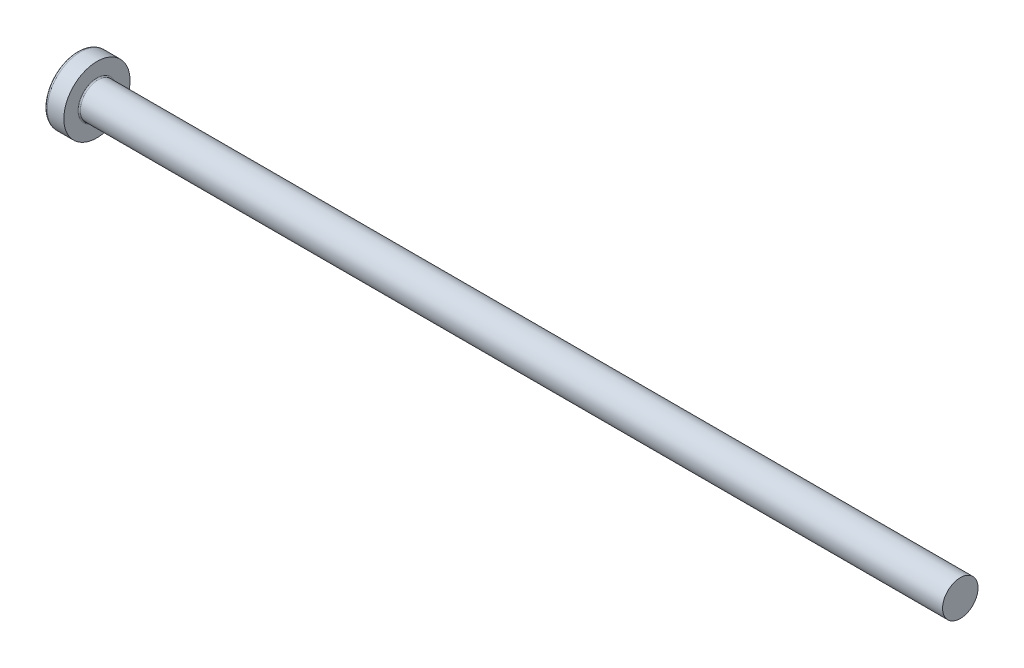
ISO-10303-21;
HEADER;
FILE_DESCRIPTION(('STEP AP214'),'2;1');
FILE_NAME('part.step','',(''),(''),'','','');
FILE_SCHEMA(('AUTOMOTIVE_DESIGN { 1 0 10303 214 1 1 1 1 }'));
ENDSEC;
DATA;
#1=APPLICATION_CONTEXT('core data for automotive mechanical design processes');
#2=APPLICATION_PROTOCOL_DEFINITION('international standard','automotive_design',2000,#1);
#3=PRODUCT_CONTEXT('',#1,'mechanical');
#4=PRODUCT('Part','Part','',(#3));
#5=PRODUCT_RELATED_PRODUCT_CATEGORY('part','',(#4));
#6=PRODUCT_DEFINITION_FORMATION('','',#4);
#7=PRODUCT_DEFINITION_CONTEXT('part definition',#1,'design');
#8=PRODUCT_DEFINITION('design','',#6,#7);
#9=PRODUCT_DEFINITION_SHAPE('','',#8);
#10=(LENGTH_UNIT() NAMED_UNIT(*) SI_UNIT(.MILLI.,.METRE.));
#11=(NAMED_UNIT(*) PLANE_ANGLE_UNIT() SI_UNIT($,.RADIAN.));
#12=(NAMED_UNIT(*) SI_UNIT($,.STERADIAN.) SOLID_ANGLE_UNIT());
#13=UNCERTAINTY_MEASURE_WITH_UNIT(LENGTH_MEASURE(1.E-05),#10,'distance_accuracy_value','');
#14=(GEOMETRIC_REPRESENTATION_CONTEXT(3) GLOBAL_UNCERTAINTY_ASSIGNED_CONTEXT((#13)) GLOBAL_UNIT_ASSIGNED_CONTEXT((#10,
#11,#12)) REPRESENTATION_CONTEXT('',''));
#15=CARTESIAN_POINT('',(0.,0.,0.));
#16=DIRECTION('',(0.,0.,1.));
#17=DIRECTION('',(1.,0.,0.));
#18=AXIS2_PLACEMENT_3D('',#15,#16,#17);
#19=CARTESIAN_POINT('',(5.,0.,0.));
#20=DIRECTION('',(-1.,0.,0.));
#21=DIRECTION('',(0.,1.,0.));
#22=AXIS2_PLACEMENT_3D('',#19,#20,#21);
#23=SPHERICAL_SURFACE('',#22,5.);
#24=CARTESIAN_POINT('',(0.775371598933733,0.,0.));
#25=DIRECTION('',(-1.,0.,0.));
#26=DIRECTION('',(0.,0.,1.));
#27=AXIS2_PLACEMENT_3D('',#24,#25,#26);
#28=CIRCLE('',#27,2.67441860465116);
#29=CARTESIAN_POINT('',(0.775371598933733,0.,2.67441860465116));
#30=VERTEX_POINT('',#29);
#31=EDGE_CURVE('E246',#30,#30,#28,.T.);
#32=ORIENTED_EDGE('',*,*,#31,.T.);
#33=EDGE_LOOP('',(#32));
#34=FACE_BOUND('',#33,.T.);
#35=CARTESIAN_POINT('',(0.0457951200896417,0.,0.));
#36=DIRECTION('',(1.,0.,0.));
#37=DIRECTION('',(0.,0.,-1.));
#38=AXIS2_PLACEMENT_3D('',#35,#36,#37);
#39=CIRCLE('',#38,0.675169614150692);
#40=CARTESIAN_POINT('',(0.0457951200896426,-0.369999999999998,-0.564760133040918));
#41=VERTEX_POINT('',#40);
#42=CARTESIAN_POINT('',(0.0457951200896417,-0.564760133040915,-0.37));
#43=VERTEX_POINT('',#42);
#44=EDGE_CURVE('E422',#41,#43,#39,.F.);
#45=ORIENTED_EDGE('',*,*,#44,.F.);
#46=CARTESIAN_POINT('',(5.,-0.37,0.));
#47=DIRECTION('',(0.,1.,0.));
#48=DIRECTION('',(0.,0.,1.));
#49=AXIS2_PLACEMENT_3D('',#46,#47,#48);
#50=CIRCLE('',#49,4.98629120689917);
#51=CARTESIAN_POINT('',(0.187869734228639,-0.369999999999995,-1.30633162146802));
#52=VERTEX_POINT('',#51);
#53=EDGE_CURVE('E327',#52,#41,#50,.T.);
#54=ORIENTED_EDGE('',*,*,#53,.F.);
#55=CARTESIAN_POINT('',(4.56358262530798,0.,0.875317983305919));
#56=DIRECTION('',(0.446197753347436,0.,-0.894934391398443));
#57=DIRECTION('',(-0.894934391398443,0.,-0.446197753347436));
#58=AXIS2_PLACEMENT_3D('',#55,#56,#57);
#59=CIRCLE('',#58,4.90340272700175);
#60=CARTESIAN_POINT('',(0.18786973422864,0.370000000000005,-1.30633162146802));
#61=VERTEX_POINT('',#60);
#62=EDGE_CURVE('E292',#52,#61,#59,.T.);
#63=ORIENTED_EDGE('',*,*,#62,.T.);
#64=CARTESIAN_POINT('',(5.,0.37,0.));
#65=DIRECTION('',(0.,-1.,0.));
#66=DIRECTION('',(0.,0.,-1.));
#67=AXIS2_PLACEMENT_3D('',#64,#65,#66);
#68=CIRCLE('',#67,4.98629120689917);
#69=CARTESIAN_POINT('',(0.0457951200896425,0.370000000000002,-0.564760133040916));
#70=VERTEX_POINT('',#69);
#71=EDGE_CURVE('E361',#70,#61,#68,.T.);
#72=ORIENTED_EDGE('',*,*,#71,.F.);
#73=CARTESIAN_POINT('',(0.0457951200896417,0.564760133040916,-0.37));
#74=VERTEX_POINT('',#73);
#75=EDGE_CURVE('E552',#74,#70,#39,.F.);
#76=ORIENTED_EDGE('',*,*,#75,.F.);
#77=CARTESIAN_POINT('',(5.,0.,-0.37));
#78=DIRECTION('',(0.,0.,1.));
#79=DIRECTION('',(1.,0.,0.));
#80=AXIS2_PLACEMENT_3D('',#77,#78,#79);
#81=CIRCLE('',#80,4.98629120689917);
#82=CARTESIAN_POINT('',(0.18786973422864,1.30633162146802,-0.37));
#83=VERTEX_POINT('',#82);
#84=EDGE_CURVE('E284',#83,#74,#81,.T.);
#85=ORIENTED_EDGE('',*,*,#84,.F.);
#86=CARTESIAN_POINT('',(4.56358262530798,-0.87531798330592,0.));
#87=DIRECTION('',(0.446197753347436,0.894934391398443,0.));
#88=DIRECTION('',(-0.894934391398442,0.446197753347436,0.));
#89=AXIS2_PLACEMENT_3D('',#86,#87,#88);
#90=CIRCLE('',#89,4.90340272700175);
#91=CARTESIAN_POINT('',(0.18786973422864,1.30633162146802,0.37));
#92=VERTEX_POINT('',#91);
#93=EDGE_CURVE('E288',#83,#92,#90,.T.);
#94=ORIENTED_EDGE('',*,*,#93,.T.);
#95=CARTESIAN_POINT('',(5.,0.,0.37));
#96=DIRECTION('',(0.,0.,-1.));
#97=DIRECTION('',(0.,1.,0.));
#98=AXIS2_PLACEMENT_3D('',#95,#96,#97);
#99=CIRCLE('',#98,4.98629120689917);
#100=CARTESIAN_POINT('',(0.0457951200896417,0.564760133040916,0.37));
#101=VERTEX_POINT('',#100);
#102=EDGE_CURVE('E279',#101,#92,#99,.T.);
#103=ORIENTED_EDGE('',*,*,#102,.F.);
#104=CARTESIAN_POINT('',(0.0457951200896434,0.369999999999998,0.564760133040918));
#105=VERTEX_POINT('',#104);
#106=EDGE_CURVE('E436',#105,#101,#39,.F.);
#107=ORIENTED_EDGE('',*,*,#106,.F.);
#108=CARTESIAN_POINT('',(0.18786973422864,0.369999999999995,1.30633162146802));
#109=VERTEX_POINT('',#108);
#110=EDGE_CURVE('E305',#109,#105,#68,.T.);
#111=ORIENTED_EDGE('',*,*,#110,.F.);
#112=CARTESIAN_POINT('',(4.56358262530798,0.,-0.87531798330592));
#113=DIRECTION('',(0.446197753347436,0.,0.894934391398443));
#114=DIRECTION('',(0.894934391398442,0.,-0.446197753347436));
#115=AXIS2_PLACEMENT_3D('',#112,#113,#114);
#116=CIRCLE('',#115,4.90340272700175);
#117=CARTESIAN_POINT('',(0.18786973422864,-0.370000000000005,1.30633162146802));
#118=VERTEX_POINT('',#117);
#119=EDGE_CURVE('E56',#109,#118,#116,.T.);
#120=ORIENTED_EDGE('',*,*,#119,.T.);
#121=CARTESIAN_POINT('',(0.0457951200896421,-0.370000000000002,0.564760133040916));
#122=VERTEX_POINT('',#121);
#123=EDGE_CURVE('E302',#122,#118,#50,.T.);
#124=ORIENTED_EDGE('',*,*,#123,.F.);
#125=CARTESIAN_POINT('',(0.0457951200896417,-0.564760133040916,0.37));
#126=VERTEX_POINT('',#125);
#127=EDGE_CURVE('E432',#126,#122,#39,.F.);
#128=ORIENTED_EDGE('',*,*,#127,.F.);
#129=CARTESIAN_POINT('',(0.187869734228639,-1.30633162146802,0.37));
#130=VERTEX_POINT('',#129);
#131=EDGE_CURVE('E280',#130,#126,#99,.T.);
#132=ORIENTED_EDGE('',*,*,#131,.F.);
#133=CARTESIAN_POINT('',(4.56358262530798,0.875317983305919,0.));
#134=DIRECTION('',(0.446197753347436,-0.894934391398443,0.));
#135=DIRECTION('',(0.894934391398443,0.446197753347436,0.));
#136=AXIS2_PLACEMENT_3D('',#133,#134,#135);
#137=CIRCLE('',#136,4.90340272700175);
#138=CARTESIAN_POINT('',(0.18786973422864,-1.30633162146802,-0.37));
#139=VERTEX_POINT('',#138);
#140=EDGE_CURVE('E275',#130,#139,#137,.T.);
#141=ORIENTED_EDGE('',*,*,#140,.T.);
#142=EDGE_CURVE('E71',#43,#139,#81,.T.);
#143=ORIENTED_EDGE('',*,*,#142,.F.);
#144=EDGE_LOOP('',(#45,#54,#63,#72,#76,#85,#94,#103,#107,#111,#120,#124,#128,#132,#141,#143));
#145=FACE_BOUND('',#144,.T.);
#146=ADVANCED_FACE('F41',(#34,#145),#23,.T.);
#147=CARTESIAN_POINT('',(1.75,0.527482331818931,-0.37));
#148=DIRECTION('',(0.,0.,1.));
#149=DIRECTION('',(1.,0.,0.));
#150=AXIS2_PLACEMENT_3D('',#147,#148,#149);
#151=PLANE('',#150);
#152=ORIENTED_EDGE('',*,*,#84,.T.);
#153=CARTESIAN_POINT('',(-0.987293237053716,0.649401255967161,-0.37));
#154=CARTESIAN_POINT('',(-0.781914975317084,0.632865887002871,-0.37));
#155=CARTESIAN_POINT('',(-0.576547882393372,0.616188977635081,-0.37));
#156=CARTESIAN_POINT('',(-0.165841599226327,0.582441031964227,-0.37));
#157=CARTESIAN_POINT('',(0.0394975903090452,0.56536998705488,-0.37));
#158=CARTESIAN_POINT('',(0.450133475422572,0.530723441326535,-0.37));
#159=CARTESIAN_POINT('',(0.655430171010573,0.513147940624557,-0.37));
#160=CARTESIAN_POINT('',(1.06596140177934,0.477314957985794,-0.37));
#161=CARTESIAN_POINT('',(1.2711959378071,0.459057485806066,-0.37));
#162=CARTESIAN_POINT('',(1.61065292365626,0.428051938688768,-0.37));
#163=CARTESIAN_POINT('',(1.74490059995643,0.415580824990931,-0.37));
#164=CARTESIAN_POINT('',(2.01334321762763,0.390092023404979,-0.37));
#165=CARTESIAN_POINT('',(2.14753815934577,0.377074339177353,-0.37));
#166=CARTESIAN_POINT('',(2.41586354151957,0.350315629452843,-0.37));
#167=CARTESIAN_POINT('',(2.5499939784531,0.33657456817765,-0.37));
#168=CARTESIAN_POINT('',(2.81814173295471,0.308004077741875,-0.37));
#169=CARTESIAN_POINT('',(2.95215904765134,0.293174621747065,-0.37));
#170=CARTESIAN_POINT('',(3.0860955068368,0.277618485071816,-0.37));
#171=B_SPLINE_CURVE_WITH_KNOTS('',3,(#153,#154,#155,#156,#157,#158,#159,#160,#161,#162,#163,
#164,#165,#166,#167,#168,#169,#170),.UNSPECIFIED.,.F.,.F.,(4,2,2,2,2,2,2,2,4),(0.,
0.618128793984691,1.23627109812525,1.85441325887562,2.4725465791681,2.87702276218609,
3.28149623678161,3.68598973550942,4.09049321032311),.UNSPECIFIED.);
#172=CARTESIAN_POINT('',(1.75,0.415013252800437,-0.37));
#173=VERTEX_POINT('',#172);
#174=EDGE_CURVE('E479',#74,#173,#171,.T.);
#175=ORIENTED_EDGE('',*,*,#174,.T.);
#176=DIRECTION('',(0.,1.,0.));
#177=VECTOR('',#176,1.);
#178=CARTESIAN_POINT('',(1.75,-0.527482331818931,-0.37));
#179=LINE('',#178,#177);
#180=CARTESIAN_POINT('',(1.75,0.527482331818931,-0.37));
#181=VERTEX_POINT('',#180);
#182=EDGE_CURVE('E400',#173,#181,#179,.T.);
#183=ORIENTED_EDGE('',*,*,#182,.T.);
#184=DIRECTION('',(0.894934391398442,-0.446197753347436,0.));
#185=VECTOR('',#184,1.);
#186=CARTESIAN_POINT('',(0.,1.4,-0.37));
#187=LINE('',#186,#185);
#188=EDGE_CURVE('E247',#83,#181,#187,.T.);
#189=ORIENTED_EDGE('',*,*,#188,.F.);
#190=EDGE_LOOP('',(#152,#175,#183,#189));
#191=FACE_BOUND('',#190,.T.);
#192=ADVANCED_FACE('F201',(#191),#151,.T.);
#193=CARTESIAN_POINT('',(1.75,-0.527482331818931,-0.37));
#194=VERTEX_POINT('',#193);
#195=CARTESIAN_POINT('',(1.75,-0.415013252800437,-0.37));
#196=VERTEX_POINT('',#195);
#197=EDGE_CURVE('E259',#194,#196,#179,.T.);
#198=ORIENTED_EDGE('',*,*,#197,.T.);
#199=CARTESIAN_POINT('',(-0.987293237053716,-0.649401255967161,-0.37));
#200=CARTESIAN_POINT('',(-0.781914975317084,-0.632865887002871,-0.37));
#201=CARTESIAN_POINT('',(-0.576547882393372,-0.616188977635081,-0.37));
#202=CARTESIAN_POINT('',(-0.165841599226327,-0.582441031964227,-0.37));
#203=CARTESIAN_POINT('',(0.0394975903090452,-0.56536998705488,-0.37));
#204=CARTESIAN_POINT('',(0.450133475422572,-0.530723441326535,-0.37));
#205=CARTESIAN_POINT('',(0.655430171010573,-0.513147940624557,-0.37));
#206=CARTESIAN_POINT('',(1.06596140177934,-0.477314957985794,-0.37));
#207=CARTESIAN_POINT('',(1.2711959378071,-0.459057485806066,-0.37));
#208=CARTESIAN_POINT('',(1.61065292365626,-0.428051938688768,-0.37));
#209=CARTESIAN_POINT('',(1.74490059995643,-0.415580824990931,-0.37));
#210=CARTESIAN_POINT('',(2.01334321762763,-0.390092023404979,-0.37));
#211=CARTESIAN_POINT('',(2.14753815934577,-0.377074339177353,-0.37));
#212=CARTESIAN_POINT('',(2.41586354151957,-0.350315629452843,-0.37));
#213=CARTESIAN_POINT('',(2.5499939784531,-0.33657456817765,-0.37));
#214=CARTESIAN_POINT('',(2.81814173295471,-0.308004077741875,-0.37));
#215=CARTESIAN_POINT('',(2.95215904765134,-0.293174621747065,-0.37));
#216=CARTESIAN_POINT('',(3.0860955068368,-0.277618485071816,-0.37));
#217=B_SPLINE_CURVE_WITH_KNOTS('',3,(#199,#200,#201,#202,#203,#204,#205,#206,#207,#208,#209,
#210,#211,#212,#213,#214,#215,#216),.UNSPECIFIED.,.F.,.F.,(4,2,2,2,2,2,2,2,4),(0.,
0.618128793984691,1.23627109812525,1.85441325887562,2.4725465791681,2.87702276218609,
3.28149623678161,3.68598973550942,4.09049321032311),.UNSPECIFIED.);
#218=EDGE_CURVE('E466',#196,#43,#217,.F.);
#219=ORIENTED_EDGE('',*,*,#218,.T.);
#220=ORIENTED_EDGE('',*,*,#142,.T.);
#221=DIRECTION('',(0.894934391398442,0.446197753347436,0.));
#222=VECTOR('',#221,1.);
#223=CARTESIAN_POINT('',(0.,-1.4,-0.37));
#224=LINE('',#223,#222);
#225=EDGE_CURVE('E365',#139,#194,#224,.T.);
#226=ORIENTED_EDGE('',*,*,#225,.T.);
#227=EDGE_LOOP('',(#198,#219,#220,#226));
#228=FACE_BOUND('',#227,.T.);
#229=ADVANCED_FACE('F207',(#228),#151,.T.);
#230=CARTESIAN_POINT('',(1.75,-0.527482331818931,0.37));
#231=DIRECTION('',(0.,0.,-1.));
#232=DIRECTION('',(0.,1.,0.));
#233=AXIS2_PLACEMENT_3D('',#230,#231,#232);
#234=PLANE('',#233);
#235=DIRECTION('',(0.,-1.,0.));
#236=VECTOR('',#235,1.);
#237=CARTESIAN_POINT('',(1.75,0.527482331818931,0.37));
#238=LINE('',#237,#236);
#239=CARTESIAN_POINT('',(1.75,0.527482331818931,0.37));
#240=VERTEX_POINT('',#239);
#241=CARTESIAN_POINT('',(1.75,0.415013252800437,0.37));
#242=VERTEX_POINT('',#241);
#243=EDGE_CURVE('E377',#240,#242,#238,.T.);
#244=ORIENTED_EDGE('',*,*,#243,.T.);
#245=CARTESIAN_POINT('',(-0.987293237069635,0.649401255968442,0.37));
#246=CARTESIAN_POINT('',(-0.781914975331301,0.632865887004023,0.37));
#247=CARTESIAN_POINT('',(-0.576547882405888,0.616188977636102,0.37));
#248=CARTESIAN_POINT('',(-0.16584159923544,0.582441031964983,0.37));
#249=CARTESIAN_POINT('',(0.0394975903016338,0.5653699870555,0.37));
#250=CARTESIAN_POINT('',(0.450133475420601,0.530723441326706,0.37));
#251=CARTESIAN_POINT('',(0.655430171012341,0.513147940624409,0.37));
#252=CARTESIAN_POINT('',(1.06596140178858,0.477314957984981,0.37));
#253=CARTESIAN_POINT('',(1.27119593782008,0.459057485804908,0.37));
#254=CARTESIAN_POINT('',(1.61065292367297,0.428051938687225,0.37));
#255=CARTESIAN_POINT('',(1.74490059997313,0.415580824989367,0.37));
#256=CARTESIAN_POINT('',(2.01334321764434,0.39009202340337,0.37));
#257=CARTESIAN_POINT('',(2.14753815936247,0.377074339175718,0.37));
#258=CARTESIAN_POINT('',(2.41586354153627,0.350315629451146,0.37));
#259=CARTESIAN_POINT('',(2.54999397846979,0.336574568175918,0.37));
#260=CARTESIAN_POINT('',(2.8181417329714,0.308004077740054,0.37));
#261=CARTESIAN_POINT('',(2.95215904766802,0.29317462174519,0.37));
#262=CARTESIAN_POINT('',(3.08609550685347,0.277618485069873,0.37));
#263=B_SPLINE_CURVE_WITH_KNOTS('',3,(#245,#246,#247,#248,#249,#250,#251,#252,#253,#254,#255,
#256,#257,#258,#259,#260,#261,#262),.UNSPECIFIED.,.F.,.F.,(4,2,2,2,2,2,2,2,4),(0.,
0.61812879398981,1.23627109813549,1.85441325889711,2.47254657920086,2.87702276221884,
3.28149623681436,3.68598973554218,4.09049321035586),.UNSPECIFIED.);
#264=EDGE_CURVE('E425',#242,#101,#263,.F.);
#265=ORIENTED_EDGE('',*,*,#264,.T.);
#266=ORIENTED_EDGE('',*,*,#102,.T.);
#267=DIRECTION('',(0.894934391398442,-0.446197753347436,0.));
#268=VECTOR('',#267,1.);
#269=CARTESIAN_POINT('',(0.,1.4,0.37));
#270=LINE('',#269,#268);
#271=EDGE_CURVE('E256',#92,#240,#270,.T.);
#272=ORIENTED_EDGE('',*,*,#271,.T.);
#273=EDGE_LOOP('',(#244,#265,#266,#272));
#274=FACE_BOUND('',#273,.T.);
#275=ADVANCED_FACE('F504',(#274),#234,.T.);
#276=ORIENTED_EDGE('',*,*,#131,.T.);
#277=CARTESIAN_POINT('',(-0.987293237069635,-0.649401255968442,0.37));
#278=CARTESIAN_POINT('',(-0.781914975331301,-0.632865887004023,0.37));
#279=CARTESIAN_POINT('',(-0.576547882405888,-0.616188977636102,0.37));
#280=CARTESIAN_POINT('',(-0.16584159923544,-0.582441031964983,0.37));
#281=CARTESIAN_POINT('',(0.0394975903016338,-0.5653699870555,0.37));
#282=CARTESIAN_POINT('',(0.450133475420601,-0.530723441326706,0.37));
#283=CARTESIAN_POINT('',(0.655430171012341,-0.513147940624409,0.37));
#284=CARTESIAN_POINT('',(1.06596140178858,-0.477314957984981,0.37));
#285=CARTESIAN_POINT('',(1.27119593782008,-0.459057485804908,0.37));
#286=CARTESIAN_POINT('',(1.61065292367297,-0.428051938687225,0.37));
#287=CARTESIAN_POINT('',(1.74490059997313,-0.415580824989367,0.37));
#288=CARTESIAN_POINT('',(2.01334321764434,-0.390092023403371,0.37));
#289=CARTESIAN_POINT('',(2.14753815936247,-0.377074339175718,0.37));
#290=CARTESIAN_POINT('',(2.41586354153627,-0.350315629451146,0.37));
#291=CARTESIAN_POINT('',(2.54999397846979,-0.336574568175918,0.37));
#292=CARTESIAN_POINT('',(2.8181417329714,-0.308004077740054,0.37));
#293=CARTESIAN_POINT('',(2.95215904766802,-0.29317462174519,0.37));
#294=CARTESIAN_POINT('',(3.08609550685347,-0.277618485069873,0.37));
#295=B_SPLINE_CURVE_WITH_KNOTS('',3,(#277,#278,#279,#280,#281,#282,#283,#284,#285,#286,#287,
#288,#289,#290,#291,#292,#293,#294),.UNSPECIFIED.,.F.,.F.,(4,2,2,2,2,2,2,2,4),(0.,
0.61812879398981,1.23627109813549,1.85441325889711,2.47254657920086,2.87702276221884,
3.28149623681436,3.68598973554218,4.09049321035586),.UNSPECIFIED.);
#296=CARTESIAN_POINT('',(1.75,-0.415013252800437,0.37));
#297=VERTEX_POINT('',#296);
#298=EDGE_CURVE('E437',#126,#297,#295,.T.);
#299=ORIENTED_EDGE('',*,*,#298,.T.);
#300=CARTESIAN_POINT('',(1.75,-0.527482331818932,0.37));
#301=VERTEX_POINT('',#300);
#302=EDGE_CURVE('E380',#297,#301,#238,.T.);
#303=ORIENTED_EDGE('',*,*,#302,.T.);
#304=DIRECTION('',(0.894934391398443,0.446197753347436,0.));
#305=VECTOR('',#304,1.);
#306=CARTESIAN_POINT('',(0.,-1.4,0.37));
#307=LINE('',#306,#305);
#308=EDGE_CURVE('E368',#130,#301,#307,.T.);
#309=ORIENTED_EDGE('',*,*,#308,.F.);
#310=EDGE_LOOP('',(#276,#299,#303,#309));
#311=FACE_BOUND('',#310,.T.);
#312=ADVANCED_FACE('F501',(#311),#234,.T.);
#313=CARTESIAN_POINT('',(1.75,0.527482331818931,0.37));
#314=DIRECTION('',(0.446197753347436,0.894934391398443,0.));
#315=DIRECTION('',(-0.894934391398442,0.446197753347436,0.));
#316=AXIS2_PLACEMENT_3D('',#313,#314,#315);
#317=PLANE('',#316);
#318=CARTESIAN_POINT('',(2.6696526882832,0.0689604923233249,0.));
#319=DIRECTION('',(0.446197753347436,0.894934391398443,0.));
#320=DIRECTION('',(-0.894934391398443,0.446197753347436,0.));
#321=AXIS2_PLACEMENT_3D('',#318,#319,#320);
#322=ELLIPSE('',#321,1.10195897609154,0.486831694838766);
#323=CARTESIAN_POINT('',(1.75,0.527482331818932,0.175779377683682));
#324=VERTEX_POINT('',#323);
#325=CARTESIAN_POINT('',(1.75,0.527482331818932,-0.175779377683682));
#326=VERTEX_POINT('',#325);
#327=EDGE_CURVE('E333',#324,#326,#322,.F.);
#328=ORIENTED_EDGE('',*,*,#327,.F.);
#329=DIRECTION('',(0.,0.,-1.));
#330=VECTOR('',#329,1.);
#331=CARTESIAN_POINT('',(1.75,0.527482331818931,0.37));
#332=LINE('',#331,#330);
#333=EDGE_CURVE('E381',#240,#324,#332,.T.);
#334=ORIENTED_EDGE('',*,*,#333,.F.);
#335=ORIENTED_EDGE('',*,*,#271,.F.);
#336=ORIENTED_EDGE('',*,*,#93,.F.);
#337=ORIENTED_EDGE('',*,*,#188,.T.);
#338=EDGE_CURVE('E384',#326,#181,#332,.T.);
#339=ORIENTED_EDGE('',*,*,#338,.F.);
#340=EDGE_LOOP('',(#328,#334,#335,#336,#337,#339));
#341=FACE_BOUND('',#340,.T.);
#342=ADVANCED_FACE('F498',(#341),#317,.F.);
#343=CARTESIAN_POINT('',(0.,-1.4,-0.37));
#344=DIRECTION('',(0.446197753347436,-0.894934391398443,0.));
#345=DIRECTION('',(0.894934391398443,0.446197753347436,0.));
#346=AXIS2_PLACEMENT_3D('',#343,#344,#345);
#347=PLANE('',#346);
#348=CARTESIAN_POINT('',(2.6696526882832,-0.0689604923233252,0.));
#349=DIRECTION('',(0.446197753347436,-0.894934391398443,0.));
#350=DIRECTION('',(-0.894934391398443,-0.446197753347436,0.));
#351=AXIS2_PLACEMENT_3D('',#348,#349,#350);
#352=ELLIPSE('',#351,1.10195897609154,0.486831694838766);
#353=CARTESIAN_POINT('',(1.75,-0.527482331818932,-0.175779377683681));
#354=VERTEX_POINT('',#353);
#355=CARTESIAN_POINT('',(1.75,-0.527482331818932,0.175779377683681));
#356=VERTEX_POINT('',#355);
#357=EDGE_CURVE('E427',#354,#356,#352,.F.);
#358=ORIENTED_EDGE('',*,*,#357,.F.);
#359=DIRECTION('',(0.,0.,1.));
#360=VECTOR('',#359,1.);
#361=CARTESIAN_POINT('',(1.75,-0.527482331818931,-0.37));
#362=LINE('',#361,#360);
#363=EDGE_CURVE('E372',#194,#354,#362,.T.);
#364=ORIENTED_EDGE('',*,*,#363,.F.);
#365=ORIENTED_EDGE('',*,*,#225,.F.);
#366=ORIENTED_EDGE('',*,*,#140,.F.);
#367=ORIENTED_EDGE('',*,*,#308,.T.);
#368=EDGE_CURVE('E376',#356,#301,#362,.T.);
#369=ORIENTED_EDGE('',*,*,#368,.F.);
#370=EDGE_LOOP('',(#358,#364,#365,#366,#367,#369));
#371=FACE_BOUND('',#370,.T.);
#372=ADVANCED_FACE('F500',(#371),#347,.F.);
#373=CARTESIAN_POINT('',(1.75,0.527482331818931,-0.37));
#374=DIRECTION('',(-1.,0.,0.));
#375=DIRECTION('',(0.,0.,1.));
#376=AXIS2_PLACEMENT_3D('',#373,#374,#375);
#377=PLANE('',#376);
#378=DIRECTION('',(0.,1.,0.));
#379=VECTOR('',#378,1.);
#380=CARTESIAN_POINT('',(1.75,-0.370000000000002,0.52748233181893));
#381=LINE('',#380,#379);
#382=CARTESIAN_POINT('',(1.75,-0.370000000000002,0.52748233181893));
#383=VERTEX_POINT('',#382);
#384=CARTESIAN_POINT('',(1.75,-0.175779377683686,0.52748233181893));
#385=VERTEX_POINT('',#384);
#386=EDGE_CURVE('E351',#383,#385,#381,.T.);
#387=ORIENTED_EDGE('',*,*,#386,.T.);
#388=CARTESIAN_POINT('',(1.75,0.,0.));
#389=DIRECTION('',(-1.,0.,0.));
#390=DIRECTION('',(0.,0.,1.));
#391=AXIS2_PLACEMENT_3D('',#388,#389,#390);
#392=CIRCLE('',#391,0.556);
#393=CARTESIAN_POINT('',(1.75,-0.370000000000001,0.415013252800436));
#394=VERTEX_POINT('',#393);
#395=EDGE_CURVE('E569',#394,#385,#392,.T.);
#396=ORIENTED_EDGE('',*,*,#395,.F.);
#397=DIRECTION('',(0.,0.,-1.));
#398=VECTOR('',#397,1.);
#399=CARTESIAN_POINT('',(1.75,-0.370000000000002,0.52748233181893));
#400=LINE('',#399,#398);
#401=EDGE_CURVE('E346',#383,#394,#400,.T.);
#402=ORIENTED_EDGE('',*,*,#401,.F.);
#403=EDGE_LOOP('',(#387,#396,#402));
#404=FACE_BOUND('',#403,.T.);
#405=ADVANCED_FACE('F512',(#404),#377,.T.);
#406=ORIENTED_EDGE('',*,*,#302,.F.);
#407=EDGE_CURVE('E592',#356,#297,#392,.T.);
#408=ORIENTED_EDGE('',*,*,#407,.F.);
#409=ORIENTED_EDGE('',*,*,#368,.T.);
#410=EDGE_LOOP('',(#406,#408,#409));
#411=FACE_BOUND('',#410,.T.);
#412=ADVANCED_FACE('F526',(#411),#377,.T.);
#413=ORIENTED_EDGE('',*,*,#363,.T.);
#414=EDGE_CURVE('E611',#196,#354,#392,.T.);
#415=ORIENTED_EDGE('',*,*,#414,.F.);
#416=ORIENTED_EDGE('',*,*,#197,.F.);
#417=EDGE_LOOP('',(#413,#415,#416));
#418=FACE_BOUND('',#417,.T.);
#419=ADVANCED_FACE('F649',(#418),#377,.T.);
#420=CARTESIAN_POINT('',(1.75,-0.369999999999998,-0.415013252800438));
#421=VERTEX_POINT('',#420);
#422=CARTESIAN_POINT('',(1.75,-0.369999999999998,-0.527482331818933));
#423=VERTEX_POINT('',#422);
#424=EDGE_CURVE('E350',#421,#423,#400,.T.);
#425=ORIENTED_EDGE('',*,*,#424,.F.);
#426=CARTESIAN_POINT('',(1.75,-0.17577937768368,-0.527482331818932));
#427=VERTEX_POINT('',#426);
#428=EDGE_CURVE('E63',#427,#421,#392,.T.);
#429=ORIENTED_EDGE('',*,*,#428,.F.);
#430=DIRECTION('',(0.,-1.,0.));
#431=VECTOR('',#430,1.);
#432=CARTESIAN_POINT('',(1.75,0.370000000000002,-0.52748233181893));
#433=LINE('',#432,#431);
#434=EDGE_CURVE('E345',#427,#423,#433,.T.);
#435=ORIENTED_EDGE('',*,*,#434,.T.);
#436=EDGE_LOOP('',(#425,#429,#435));
#437=FACE_BOUND('',#436,.T.);
#438=ADVANCED_FACE('F538',(#437),#377,.T.);
#439=CARTESIAN_POINT('',(1.75,0.370000000000002,-0.52748233181893));
#440=VERTEX_POINT('',#439);
#441=CARTESIAN_POINT('',(1.75,0.175779377683684,-0.527482331818931));
#442=VERTEX_POINT('',#441);
#443=EDGE_CURVE('E341',#440,#442,#433,.T.);
#444=ORIENTED_EDGE('',*,*,#443,.T.);
#445=CARTESIAN_POINT('',(1.75,0.370000000000001,-0.415013252800436));
#446=VERTEX_POINT('',#445);
#447=EDGE_CURVE('E583',#446,#442,#392,.T.);
#448=ORIENTED_EDGE('',*,*,#447,.F.);
#449=DIRECTION('',(0.,0.,1.));
#450=VECTOR('',#449,1.);
#451=CARTESIAN_POINT('',(1.75,0.370000000000002,-0.52748233181893));
#452=LINE('',#451,#450);
#453=EDGE_CURVE('E356',#440,#446,#452,.T.);
#454=ORIENTED_EDGE('',*,*,#453,.F.);
#455=EDGE_LOOP('',(#444,#448,#454));
#456=FACE_BOUND('',#455,.T.);
#457=ADVANCED_FACE('F534',(#456),#377,.T.);
#458=ORIENTED_EDGE('',*,*,#182,.F.);
#459=EDGE_CURVE('E541',#326,#173,#392,.T.);
#460=ORIENTED_EDGE('',*,*,#459,.F.);
#461=ORIENTED_EDGE('',*,*,#338,.T.);
#462=EDGE_LOOP('',(#458,#460,#461));
#463=FACE_BOUND('',#462,.T.);
#464=ADVANCED_FACE('F529',(#463),#377,.T.);
#465=ORIENTED_EDGE('',*,*,#333,.T.);
#466=EDGE_CURVE('E599',#242,#324,#392,.T.);
#467=ORIENTED_EDGE('',*,*,#466,.F.);
#468=ORIENTED_EDGE('',*,*,#243,.F.);
#469=EDGE_LOOP('',(#465,#467,#468));
#470=FACE_BOUND('',#469,.T.);
#471=ADVANCED_FACE('F517',(#470),#377,.T.);
#472=CARTESIAN_POINT('',(1.75,0.369999999999998,0.527482331818932));
#473=DIRECTION('',(0.,-1.,0.));
#474=DIRECTION('',(1.,0.,0.));
#475=AXIS2_PLACEMENT_3D('',#472,#473,#474);
#476=PLANE('',#475);
#477=ORIENTED_EDGE('',*,*,#110,.T.);
#478=CARTESIAN_POINT('',(-0.987293237069635,0.369999999999998,0.649401255968443));
#479=CARTESIAN_POINT('',(-0.781914975331301,0.369999999999998,0.632865887004024));
#480=CARTESIAN_POINT('',(-0.576547882405888,0.369999999999998,0.616188977636103));
#481=CARTESIAN_POINT('',(-0.16584159923544,0.369999999999998,0.582441031964984));
#482=CARTESIAN_POINT('',(0.0394975903016338,0.369999999999998,0.565369987055501));
#483=CARTESIAN_POINT('',(0.450133475420601,0.369999999999998,0.530723441326707));
#484=CARTESIAN_POINT('',(0.655430171012341,0.369999999999998,0.51314794062441));
#485=CARTESIAN_POINT('',(1.06596140178858,0.369999999999998,0.477314957984982));
#486=CARTESIAN_POINT('',(1.27119593782008,0.369999999999998,0.459057485804909));
#487=CARTESIAN_POINT('',(1.61065292367297,0.369999999999999,0.428051938687226));
#488=CARTESIAN_POINT('',(1.74490059997313,0.369999999999999,0.415580824989369));
#489=CARTESIAN_POINT('',(2.01334321764434,0.369999999999999,0.390092023403372));
#490=CARTESIAN_POINT('',(2.14753815936247,0.369999999999999,0.37707433917572));
#491=CARTESIAN_POINT('',(2.41586354153627,0.369999999999999,0.350315629451147));
#492=CARTESIAN_POINT('',(2.54999397846979,0.369999999999999,0.336574568175919));
#493=CARTESIAN_POINT('',(2.8181417329714,0.369999999999999,0.308004077740055));
#494=CARTESIAN_POINT('',(2.95215904766802,0.369999999999999,0.293174621745191));
#495=CARTESIAN_POINT('',(3.08609550685347,0.369999999999999,0.277618485069875));
#496=B_SPLINE_CURVE_WITH_KNOTS('',3,(#478,#479,#480,#481,#482,#483,#484,#485,#486,#487,#488,
#489,#490,#491,#492,#493,#494,#495),.UNSPECIFIED.,.F.,.F.,(4,2,2,2,2,2,2,2,4),(0.,
0.61812879398981,1.23627109813549,1.85441325889711,2.47254657920086,2.87702276221884,
3.28149623681436,3.68598973554218,4.09049321035586),.UNSPECIFIED.);
#497=CARTESIAN_POINT('',(1.75,0.369999999999999,0.415013252800439));
#498=VERTEX_POINT('',#497);
#499=EDGE_CURVE('E435',#105,#498,#496,.T.);
#500=ORIENTED_EDGE('',*,*,#499,.T.);
#501=CARTESIAN_POINT('',(1.75,0.369999999999998,0.527482331818932));
#502=VERTEX_POINT('',#501);
#503=EDGE_CURVE('E320',#498,#502,#452,.T.);
#504=ORIENTED_EDGE('',*,*,#503,.T.);
#505=DIRECTION('',(0.894934391398442,0.,-0.446197753347436));
#506=VECTOR('',#505,1.);
#507=CARTESIAN_POINT('',(0.,0.369999999999995,1.4));
#508=LINE('',#507,#506);
#509=EDGE_CURVE('E313',#109,#502,#508,.T.);
#510=ORIENTED_EDGE('',*,*,#509,.F.);
#511=EDGE_LOOP('',(#477,#500,#504,#510));
#512=FACE_BOUND('',#511,.T.);
#513=ADVANCED_FACE('F317',(#512),#476,.T.);
#514=CARTESIAN_POINT('',(1.75,-0.369999999999998,-0.527482331818933));
#515=DIRECTION('',(0.,1.,0.));
#516=DIRECTION('',(0.,0.,1.));
#517=AXIS2_PLACEMENT_3D('',#514,#515,#516);
#518=PLANE('',#517);
#519=ORIENTED_EDGE('',*,*,#401,.T.);
#520=CARTESIAN_POINT('',(-0.987293237053716,-0.370000000000002,0.649401255967159));
#521=CARTESIAN_POINT('',(-0.781914975317084,-0.370000000000002,0.63286588700287));
#522=CARTESIAN_POINT('',(-0.576547882393372,-0.370000000000002,0.616188977635079));
#523=CARTESIAN_POINT('',(-0.165841599226327,-0.370000000000002,0.582441031964225));
#524=CARTESIAN_POINT('',(0.039497590309045,-0.370000000000002,0.565369987054878));
#525=CARTESIAN_POINT('',(0.450133475422572,-0.370000000000002,0.530723441326534));
#526=CARTESIAN_POINT('',(0.655430171010573,-0.370000000000002,0.513147940624556));
#527=CARTESIAN_POINT('',(1.06596140177934,-0.370000000000002,0.477314957985792));
#528=CARTESIAN_POINT('',(1.2711959378071,-0.370000000000002,0.459057485806065));
#529=CARTESIAN_POINT('',(1.61065292365626,-0.370000000000001,0.428051938688767));
#530=CARTESIAN_POINT('',(1.74490059995642,-0.370000000000001,0.41558082499093));
#531=CARTESIAN_POINT('',(2.01334321762763,-0.370000000000001,0.390092023404978));
#532=CARTESIAN_POINT('',(2.14753815934577,-0.370000000000001,0.377074339177352));
#533=CARTESIAN_POINT('',(2.41586354151957,-0.370000000000001,0.350315629452841));
#534=CARTESIAN_POINT('',(2.5499939784531,-0.370000000000001,0.336574568177649));
#535=CARTESIAN_POINT('',(2.81814173295471,-0.370000000000001,0.308004077741874));
#536=CARTESIAN_POINT('',(2.95215904765134,-0.370000000000001,0.293174621747064));
#537=CARTESIAN_POINT('',(3.0860955068368,-0.370000000000001,0.277618485071814));
#538=B_SPLINE_CURVE_WITH_KNOTS('',3,(#520,#521,#522,#523,#524,#525,#526,#527,#528,#529,#530,
#531,#532,#533,#534,#535,#536,#537),.UNSPECIFIED.,.F.,.F.,(4,2,2,2,2,2,2,2,4),(0.,
0.618128793984691,1.23627109812525,1.85441325887562,2.4725465791681,2.87702276218609,
3.28149623678161,3.68598973550942,4.09049321032311),.UNSPECIFIED.);
#539=EDGE_CURVE('E429',#394,#122,#538,.F.);
#540=ORIENTED_EDGE('',*,*,#539,.T.);
#541=ORIENTED_EDGE('',*,*,#123,.T.);
#542=DIRECTION('',(0.894934391398442,0.,-0.446197753347436));
#543=VECTOR('',#542,1.);
#544=CARTESIAN_POINT('',(0.,-0.370000000000005,1.4));
#545=LINE('',#544,#543);
#546=EDGE_CURVE('E315',#118,#383,#545,.T.);
#547=ORIENTED_EDGE('',*,*,#546,.T.);
#548=EDGE_LOOP('',(#519,#540,#541,#547));
#549=FACE_BOUND('',#548,.T.);
#550=ADVANCED_FACE('F236',(#549),#518,.T.);
#551=CARTESIAN_POINT('',(1.75,-0.370000000000002,0.52748233181893));
#552=DIRECTION('',(0.446197753347436,0.,0.894934391398443));
#553=DIRECTION('',(-0.894934391398442,0.,0.446197753347436));
#554=AXIS2_PLACEMENT_3D('',#551,#552,#553);
#555=PLANE('',#554);
#556=CARTESIAN_POINT('',(2.6696526882832,0.,0.0689604923233248));
#557=DIRECTION('',(0.446197753347436,0.,0.894934391398443));
#558=DIRECTION('',(-0.894934391398443,0.,0.446197753347436));
#559=AXIS2_PLACEMENT_3D('',#556,#557,#558);
#560=ELLIPSE('',#559,1.10195897609154,0.486831694838766);
#561=CARTESIAN_POINT('',(1.75,0.175779377683682,0.527482331818932));
#562=VERTEX_POINT('',#561);
#563=EDGE_CURVE('E433',#385,#562,#560,.F.);
#564=ORIENTED_EDGE('',*,*,#563,.F.);
#565=ORIENTED_EDGE('',*,*,#386,.F.);
#566=ORIENTED_EDGE('',*,*,#546,.F.);
#567=ORIENTED_EDGE('',*,*,#119,.F.);
#568=ORIENTED_EDGE('',*,*,#509,.T.);
#569=EDGE_CURVE('E355',#562,#502,#381,.T.);
#570=ORIENTED_EDGE('',*,*,#569,.F.);
#571=EDGE_LOOP('',(#564,#565,#566,#567,#568,#570));
#572=FACE_BOUND('',#571,.T.);
#573=ADVANCED_FACE('F311',(#572),#555,.F.);
#574=CARTESIAN_POINT('',(0.,0.370000000000005,-1.4));
#575=DIRECTION('',(0.446197753347436,0.,-0.894934391398443));
#576=DIRECTION('',(0.894934391398443,0.,0.446197753347436));
#577=AXIS2_PLACEMENT_3D('',#574,#575,#576);
#578=PLANE('',#577);
#579=CARTESIAN_POINT('',(2.6696526882832,0.,-0.0689604923233253));
#580=DIRECTION('',(0.446197753347436,0.,-0.894934391398443));
#581=DIRECTION('',(-0.894934391398443,0.,-0.446197753347436));
#582=AXIS2_PLACEMENT_3D('',#579,#580,#581);
#583=ELLIPSE('',#582,1.10195897609154,0.486831694838766);
#584=EDGE_CURVE('E557',#442,#427,#583,.F.);
#585=ORIENTED_EDGE('',*,*,#584,.F.);
#586=ORIENTED_EDGE('',*,*,#443,.F.);
#587=DIRECTION('',(0.894934391398442,0.,0.446197753347436));
#588=VECTOR('',#587,1.);
#589=CARTESIAN_POINT('',(0.,0.370000000000005,-1.4));
#590=LINE('',#589,#588);
#591=EDGE_CURVE('E330',#61,#440,#590,.T.);
#592=ORIENTED_EDGE('',*,*,#591,.F.);
#593=ORIENTED_EDGE('',*,*,#62,.F.);
#594=DIRECTION('',(0.894934391398443,0.,0.446197753347436));
#595=VECTOR('',#594,1.);
#596=CARTESIAN_POINT('',(0.,-0.369999999999995,-1.4));
#597=LINE('',#596,#595);
#598=EDGE_CURVE('E337',#52,#423,#597,.T.);
#599=ORIENTED_EDGE('',*,*,#598,.T.);
#600=ORIENTED_EDGE('',*,*,#434,.F.);
#601=EDGE_LOOP('',(#585,#586,#592,#593,#599,#600));
#602=FACE_BOUND('',#601,.T.);
#603=ADVANCED_FACE('F417',(#602),#578,.F.);
#604=ORIENTED_EDGE('',*,*,#453,.T.);
#605=CARTESIAN_POINT('',(-0.987293237053716,0.370000000000002,-0.649401255967159));
#606=CARTESIAN_POINT('',(-0.781914975317084,0.370000000000002,-0.63286588700287));
#607=CARTESIAN_POINT('',(-0.576547882393372,0.370000000000002,-0.61618897763508));
#608=CARTESIAN_POINT('',(-0.165841599226327,0.370000000000002,-0.582441031964225));
#609=CARTESIAN_POINT('',(0.039497590309045,0.370000000000002,-0.565369987054878));
#610=CARTESIAN_POINT('',(0.450133475422572,0.370000000000002,-0.530723441326533));
#611=CARTESIAN_POINT('',(0.655430171010573,0.370000000000002,-0.513147940624555));
#612=CARTESIAN_POINT('',(1.06596140177934,0.370000000000002,-0.477314957985793));
#613=CARTESIAN_POINT('',(1.2711959378071,0.370000000000002,-0.459057485806065));
#614=CARTESIAN_POINT('',(1.61065292365626,0.370000000000001,-0.428051938688767));
#615=CARTESIAN_POINT('',(1.74490059995642,0.370000000000001,-0.41558082499093));
#616=CARTESIAN_POINT('',(2.01334321762763,0.370000000000001,-0.390092023404978));
#617=CARTESIAN_POINT('',(2.14753815934577,0.370000000000001,-0.377074339177352));
#618=CARTESIAN_POINT('',(2.41586354151957,0.370000000000001,-0.350315629452841));
#619=CARTESIAN_POINT('',(2.5499939784531,0.370000000000001,-0.336574568177649));
#620=CARTESIAN_POINT('',(2.81814173295471,0.370000000000001,-0.308004077741874));
#621=CARTESIAN_POINT('',(2.95215904765134,0.370000000000001,-0.293174621747064));
#622=CARTESIAN_POINT('',(3.0860955068368,0.370000000000001,-0.277618485071814));
#623=B_SPLINE_CURVE_WITH_KNOTS('',3,(#605,#606,#607,#608,#609,#610,#611,#612,#613,#614,#615,
#616,#617,#618,#619,#620,#621,#622),.UNSPECIFIED.,.F.,.F.,(4,2,2,2,2,2,2,2,4),(0.,
0.618128793984691,1.23627109812525,1.85441325887562,2.4725465791681,2.87702276218609,
3.28149623678161,3.68598973550942,4.09049321032311),.UNSPECIFIED.);
#624=EDGE_CURVE('E413',#446,#70,#623,.F.);
#625=ORIENTED_EDGE('',*,*,#624,.T.);
#626=ORIENTED_EDGE('',*,*,#71,.T.);
#627=ORIENTED_EDGE('',*,*,#591,.T.);
#628=EDGE_LOOP('',(#604,#625,#626,#627));
#629=FACE_BOUND('',#628,.T.);
#630=ADVANCED_FACE('F234',(#629),#476,.T.);
#631=ORIENTED_EDGE('',*,*,#53,.T.);
#632=CARTESIAN_POINT('',(-0.987293237053716,-0.369999999999998,-0.649401255967162));
#633=CARTESIAN_POINT('',(-0.781914975317084,-0.369999999999998,-0.632865887002873));
#634=CARTESIAN_POINT('',(-0.576547882393372,-0.369999999999998,-0.616188977635082));
#635=CARTESIAN_POINT('',(-0.165841599226327,-0.369999999999998,-0.582441031964228));
#636=CARTESIAN_POINT('',(0.0394975903090453,-0.369999999999998,-0.565369987054881));
#637=CARTESIAN_POINT('',(0.450133475422572,-0.369999999999998,-0.530723441326536));
#638=CARTESIAN_POINT('',(0.655430171010573,-0.369999999999998,-0.513147940624558));
#639=CARTESIAN_POINT('',(1.06596140177934,-0.369999999999998,-0.477314957985795));
#640=CARTESIAN_POINT('',(1.2711959378071,-0.369999999999998,-0.459057485806067));
#641=CARTESIAN_POINT('',(1.61065292365626,-0.369999999999998,-0.42805193868877));
#642=CARTESIAN_POINT('',(1.74490059995643,-0.369999999999998,-0.415580824990932));
#643=CARTESIAN_POINT('',(2.01334321762763,-0.369999999999999,-0.390092023404981));
#644=CARTESIAN_POINT('',(2.14753815934577,-0.369999999999999,-0.377074339177355));
#645=CARTESIAN_POINT('',(2.41586354151957,-0.369999999999999,-0.350315629452844));
#646=CARTESIAN_POINT('',(2.5499939784531,-0.369999999999999,-0.336574568177652));
#647=CARTESIAN_POINT('',(2.81814173295471,-0.369999999999999,-0.308004077741877));
#648=CARTESIAN_POINT('',(2.95215904765134,-0.369999999999999,-0.293174621747066));
#649=CARTESIAN_POINT('',(3.0860955068368,-0.369999999999999,-0.277618485071817));
#650=B_SPLINE_CURVE_WITH_KNOTS('',3,(#632,#633,#634,#635,#636,#637,#638,#639,#640,#641,#642,
#643,#644,#645,#646,#647,#648,#649),.UNSPECIFIED.,.F.,.F.,(4,2,2,2,2,2,2,2,4),(0.,
0.618128793984691,1.23627109812525,1.85441325887562,2.4725465791681,2.87702276218609,
3.28149623678161,3.68598973550942,4.09049321032311),.UNSPECIFIED.);
#651=EDGE_CURVE('E11',#41,#421,#650,.T.);
#652=ORIENTED_EDGE('',*,*,#651,.T.);
#653=ORIENTED_EDGE('',*,*,#424,.T.);
#654=ORIENTED_EDGE('',*,*,#598,.F.);
#655=EDGE_LOOP('',(#631,#652,#653,#654));
#656=FACE_BOUND('',#655,.T.);
#657=ADVANCED_FACE('F229',(#656),#518,.T.);
#658=CARTESIAN_POINT('',(-25.4,0.,0.));
#659=DIRECTION('',(-1.,0.,0.));
#660=DIRECTION('',(0.,0.,1.));
#661=AXIS2_PLACEMENT_3D('',#658,#659,#660);
#662=CYLINDRICAL_SURFACE('',#661,1.5);
#663=CARTESIAN_POINT('',(2.5,0.,0.));
#664=DIRECTION('',(-1.,0.,0.));
#665=DIRECTION('',(0.,0.,1.));
#666=AXIS2_PLACEMENT_3D('',#663,#664,#665);
#667=CIRCLE('',#666,1.5);
#668=CARTESIAN_POINT('',(2.5,0.,1.5));
#669=VERTEX_POINT('',#668);
#670=EDGE_CURVE('E240',#669,#669,#667,.F.);
#671=ORIENTED_EDGE('',*,*,#670,.T.);
#672=EDGE_LOOP('',(#671));
#673=FACE_BOUND('',#672,.T.);
#674=CARTESIAN_POINT('',(75.4,0.,0.));
#675=DIRECTION('',(-1.,0.,0.));
#676=DIRECTION('',(0.,0.,1.));
#677=AXIS2_PLACEMENT_3D('',#674,#675,#676);
#678=CIRCLE('',#677,1.5);
#679=CARTESIAN_POINT('',(75.4,0.,1.5));
#680=VERTEX_POINT('',#679);
#681=EDGE_CURVE('E243',#680,#680,#678,.T.);
#682=ORIENTED_EDGE('',*,*,#681,.T.);
#683=EDGE_LOOP('',(#682));
#684=FACE_BOUND('',#683,.T.);
#685=ADVANCED_FACE('F226',(#673,#684),#662,.T.);
#686=CARTESIAN_POINT('',(2.4,1.5,0.));
#687=DIRECTION('',(-1.,0.,0.));
#688=DIRECTION('',(0.,0.,1.));
#689=AXIS2_PLACEMENT_3D('',#686,#687,#688);
#690=PLANE('',#689);
#691=CARTESIAN_POINT('',(2.4,0.,0.));
#692=DIRECTION('',(-1.,0.,0.));
#693=DIRECTION('',(0.,0.,1.));
#694=AXIS2_PLACEMENT_3D('',#691,#692,#693);
#695=CIRCLE('',#694,1.6);
#696=CARTESIAN_POINT('',(2.4,0.,1.6));
#697=VERTEX_POINT('',#696);
#698=EDGE_CURVE('E269',#697,#697,#695,.T.);
#699=ORIENTED_EDGE('',*,*,#698,.T.);
#700=EDGE_LOOP('',(#699));
#701=FACE_BOUND('',#700,.T.);
#702=CARTESIAN_POINT('',(2.4,0.,0.));
#703=DIRECTION('',(-1.,0.,0.));
#704=DIRECTION('',(0.,0.,1.));
#705=AXIS2_PLACEMENT_3D('',#702,#703,#704);
#706=CIRCLE('',#705,2.8);
#707=CARTESIAN_POINT('',(2.4,0.,2.8));
#708=VERTEX_POINT('',#707);
#709=EDGE_CURVE('E265',#708,#708,#706,.T.);
#710=ORIENTED_EDGE('',*,*,#709,.F.);
#711=EDGE_LOOP('',(#710));
#712=FACE_BOUND('',#711,.T.);
#713=ADVANCED_FACE('F223',(#701,#712),#690,.F.);
#714=CARTESIAN_POINT('',(-25.4,0.,0.));
#715=DIRECTION('',(-1.,0.,0.));
#716=DIRECTION('',(0.,0.,1.));
#717=AXIS2_PLACEMENT_3D('',#714,#715,#716);
#718=CYLINDRICAL_SURFACE('',#717,2.8);
#719=ORIENTED_EDGE('',*,*,#709,.T.);
#720=EDGE_LOOP('',(#719));
#721=FACE_BOUND('',#720,.T.);
#722=CARTESIAN_POINT('',(1.00350153259131,0.,0.));
#723=DIRECTION('',(-1.,0.,0.));
#724=DIRECTION('',(0.,0.,1.));
#725=AXIS2_PLACEMENT_3D('',#722,#723,#724);
#726=CIRCLE('',#725,2.8);
#727=CARTESIAN_POINT('',(1.00350153259131,0.,2.8));
#728=VERTEX_POINT('',#727);
#729=EDGE_CURVE('E252',#728,#728,#726,.T.);
#730=ORIENTED_EDGE('',*,*,#729,.F.);
#731=EDGE_LOOP('',(#730));
#732=FACE_BOUND('',#731,.T.);
#733=ADVANCED_FACE('F219',(#721,#732),#718,.T.);
#734=CARTESIAN_POINT('',(1.00350153259131,0.,0.));
#735=DIRECTION('',(-1.,0.,0.));
#736=DIRECTION('',(0.,0.,1.));
#737=AXIS2_PLACEMENT_3D('',#734,#735,#736);
#738=TOROIDAL_SURFACE('',#737,2.53,0.27);
#739=ORIENTED_EDGE('',*,*,#729,.T.);
#740=EDGE_LOOP('',(#739));
#741=FACE_BOUND('',#740,.T.);
#742=ORIENTED_EDGE('',*,*,#31,.F.);
#743=EDGE_LOOP('',(#742));
#744=FACE_BOUND('',#743,.T.);
#745=ADVANCED_FACE('F216',(#741,#744),#738,.T.);
#746=CARTESIAN_POINT('',(75.4,1.5,0.));
#747=DIRECTION('',(1.,0.,0.));
#748=DIRECTION('',(0.,0.,-1.));
#749=AXIS2_PLACEMENT_3D('',#746,#747,#748);
#750=PLANE('',#749);
#751=ORIENTED_EDGE('',*,*,#681,.F.);
#752=EDGE_LOOP('',(#751));
#753=FACE_BOUND('',#752,.T.);
#754=ADVANCED_FACE('F214',(#753),#750,.T.);
#755=CARTESIAN_POINT('',(2.5,0.,0.));
#756=DIRECTION('',(-1.,0.,0.));
#757=DIRECTION('',(0.,0.,1.));
#758=AXIS2_PLACEMENT_3D('',#755,#756,#757);
#759=TOROIDAL_SURFACE('',#758,1.6,0.1);
#760=ORIENTED_EDGE('',*,*,#670,.F.);
#761=EDGE_LOOP('',(#760));
#762=FACE_BOUND('',#761,.T.);
#763=ORIENTED_EDGE('',*,*,#698,.F.);
#764=EDGE_LOOP('',(#763));
#765=FACE_BOUND('',#764,.T.);
#766=ADVANCED_FACE('F43',(#762,#765),#759,.F.);
#767=ORIENTED_EDGE('',*,*,#503,.F.);
#768=EDGE_CURVE('E560',#562,#498,#392,.T.);
#769=ORIENTED_EDGE('',*,*,#768,.F.);
#770=ORIENTED_EDGE('',*,*,#569,.T.);
#771=EDGE_LOOP('',(#767,#769,#770));
#772=FACE_BOUND('',#771,.T.);
#773=ADVANCED_FACE('F514',(#772),#377,.T.);
#774=CARTESIAN_POINT('',(1.75,0.,0.));
#775=DIRECTION('',(-1.,0.,0.));
#776=DIRECTION('',(0.,0.,1.));
#777=AXIS2_PLACEMENT_3D('',#774,#775,#776);
#778=CONICAL_SURFACE('',#777,0.556,0.0698131700797659);
#779=ORIENTED_EDGE('',*,*,#327,.T.);
#780=EDGE_CURVE('E545',#324,#326,#392,.T.);
#781=ORIENTED_EDGE('',*,*,#780,.F.);
#782=EDGE_LOOP('',(#779,#781));
#783=FACE_BOUND('',#782,.T.);
#784=ADVANCED_FACE('F198',(#783),#778,.F.);
#785=ORIENTED_EDGE('',*,*,#357,.T.);
#786=EDGE_CURVE('E609',#354,#356,#392,.T.);
#787=ORIENTED_EDGE('',*,*,#786,.F.);
#788=EDGE_LOOP('',(#785,#787));
#789=FACE_BOUND('',#788,.T.);
#790=ADVANCED_FACE('F522',(#789),#778,.F.);
#791=EDGE_CURVE('E594',#498,#242,#392,.T.);
#792=ORIENTED_EDGE('',*,*,#791,.F.);
#793=ORIENTED_EDGE('',*,*,#499,.F.);
#794=ORIENTED_EDGE('',*,*,#106,.T.);
#795=ORIENTED_EDGE('',*,*,#264,.F.);
#796=EDGE_LOOP('',(#792,#793,#794,#795));
#797=FACE_BOUND('',#796,.T.);
#798=ADVANCED_FACE('F744',(#797),#778,.F.);
#799=ORIENTED_EDGE('',*,*,#563,.T.);
#800=EDGE_CURVE('E591',#385,#562,#392,.T.);
#801=ORIENTED_EDGE('',*,*,#800,.F.);
#802=EDGE_LOOP('',(#799,#801));
#803=FACE_BOUND('',#802,.T.);
#804=ADVANCED_FACE('F752',(#803),#778,.F.);
#805=ORIENTED_EDGE('',*,*,#584,.T.);
#806=EDGE_CURVE('E579',#442,#427,#392,.T.);
#807=ORIENTED_EDGE('',*,*,#806,.F.);
#808=EDGE_LOOP('',(#805,#807));
#809=FACE_BOUND('',#808,.T.);
#810=ADVANCED_FACE('F578',(#809),#778,.F.);
#811=ORIENTED_EDGE('',*,*,#127,.T.);
#812=ORIENTED_EDGE('',*,*,#539,.F.);
#813=EDGE_CURVE('E590',#297,#394,#392,.T.);
#814=ORIENTED_EDGE('',*,*,#813,.F.);
#815=ORIENTED_EDGE('',*,*,#298,.F.);
#816=EDGE_LOOP('',(#811,#812,#814,#815));
#817=FACE_BOUND('',#816,.T.);
#818=ADVANCED_FACE('F563',(#817),#778,.F.);
#819=ORIENTED_EDGE('',*,*,#75,.T.);
#820=ORIENTED_EDGE('',*,*,#624,.F.);
#821=EDGE_CURVE('E546',#173,#446,#392,.T.);
#822=ORIENTED_EDGE('',*,*,#821,.F.);
#823=ORIENTED_EDGE('',*,*,#174,.F.);
#824=EDGE_LOOP('',(#819,#820,#822,#823));
#825=FACE_BOUND('',#824,.T.);
#826=ADVANCED_FACE('F196',(#825),#778,.F.);
#827=EDGE_CURVE('E588',#421,#196,#392,.T.);
#828=ORIENTED_EDGE('',*,*,#827,.F.);
#829=ORIENTED_EDGE('',*,*,#651,.F.);
#830=ORIENTED_EDGE('',*,*,#44,.T.);
#831=ORIENTED_EDGE('',*,*,#218,.F.);
#832=EDGE_LOOP('',(#828,#829,#830,#831));
#833=FACE_BOUND('',#832,.T.);
#834=ADVANCED_FACE('F191',(#833),#778,.F.);
#835=CARTESIAN_POINT('',(1.93065535110549,0.,0.));
#836=DIRECTION('',(-1.,0.,0.));
#837=DIRECTION('',(0.,0.,1.));
#838=AXIS2_PLACEMENT_3D('',#835,#836,#837);
#839=CONICAL_SURFACE('',#838,0.,1.25663706143592);
#840=ORIENTED_EDGE('',*,*,#768,.T.);
#841=ORIENTED_EDGE('',*,*,#791,.T.);
#842=ORIENTED_EDGE('',*,*,#466,.T.);
#843=ORIENTED_EDGE('',*,*,#780,.T.);
#844=ORIENTED_EDGE('',*,*,#459,.T.);
#845=ORIENTED_EDGE('',*,*,#821,.T.);
#846=ORIENTED_EDGE('',*,*,#447,.T.);
#847=ORIENTED_EDGE('',*,*,#806,.T.);
#848=ORIENTED_EDGE('',*,*,#428,.T.);
#849=ORIENTED_EDGE('',*,*,#827,.T.);
#850=ORIENTED_EDGE('',*,*,#414,.T.);
#851=ORIENTED_EDGE('',*,*,#786,.T.);
#852=ORIENTED_EDGE('',*,*,#407,.T.);
#853=ORIENTED_EDGE('',*,*,#813,.T.);
#854=ORIENTED_EDGE('',*,*,#395,.T.);
#855=ORIENTED_EDGE('',*,*,#800,.T.);
#856=EDGE_LOOP('',(#840,#841,#842,#843,#844,#845,#846,#847,#848,#849,#850,#851,#852,#853,#854,#855));
#857=FACE_BOUND('',#856,.T.);
#858=CARTESIAN_POINT('',(1.93065535110549,0.,0.));
#859=VERTEX_POINT('',#858);
#860=VERTEX_LOOP('',#859);
#861=FACE_BOUND('',#860,.T.);
#862=ADVANCED_FACE('F189',(#857,#861),#839,.F.);
#863=CLOSED_SHELL('',(#146,#192,#229,#275,#312,#342,#372,#405,#412,#419,#438,#457,#464,#471,
#513,#550,#573,#603,#630,#657,#685,#713,#733,#745,#754,#766,#773,#784,#790,#798,#804,#810,#818,
#826,#834,#862));
#864=MANIFOLD_SOLID_BREP('B2',#863);
#865=ADVANCED_BREP_SHAPE_REPRESENTATION('',(#18,#864),#14);
#866=SHAPE_DEFINITION_REPRESENTATION(#9,#865);
ENDSEC;
END-ISO-10303-21;
